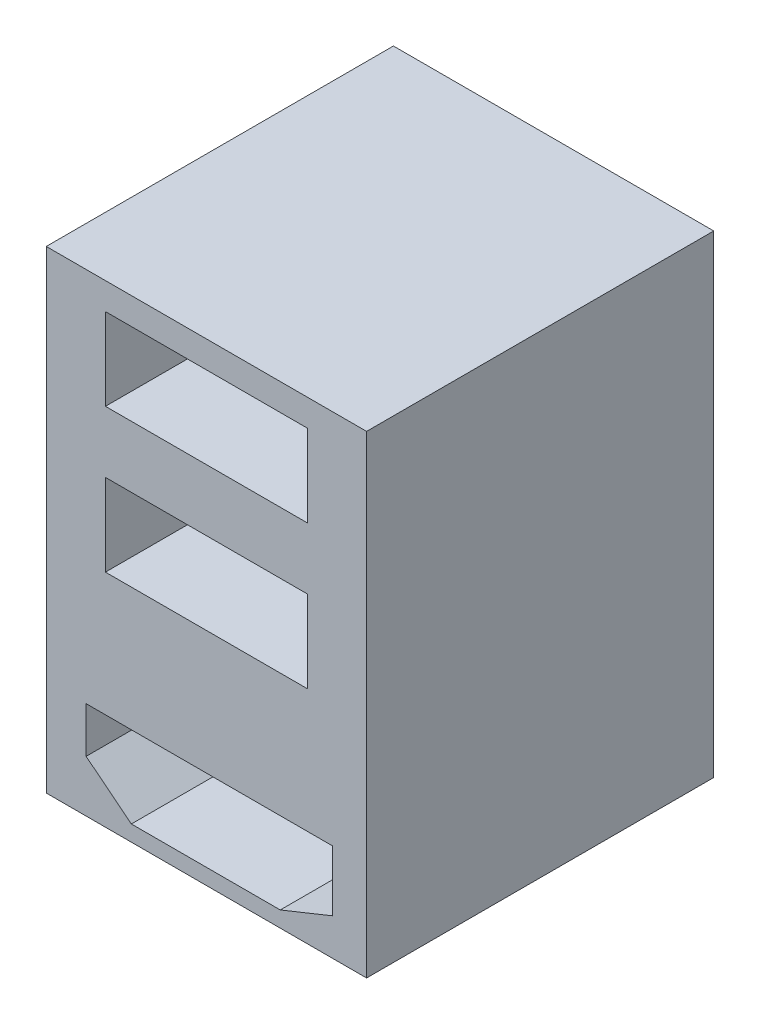
ISO-10303-21;
HEADER;
FILE_DESCRIPTION(('STEP AP214'),'2;1');
FILE_NAME('part.step','',(''),(''),'','','');
FILE_SCHEMA(('AUTOMOTIVE_DESIGN { 1 0 10303 214 1 1 1 1 }'));
ENDSEC;
DATA;
#1=APPLICATION_CONTEXT('core data for automotive mechanical design processes');
#2=APPLICATION_PROTOCOL_DEFINITION('international standard','automotive_design',2000,#1);
#3=PRODUCT_CONTEXT('',#1,'mechanical');
#4=PRODUCT('Part','Part','',(#3));
#5=PRODUCT_RELATED_PRODUCT_CATEGORY('part','',(#4));
#6=PRODUCT_DEFINITION_FORMATION('','',#4);
#7=PRODUCT_DEFINITION_CONTEXT('part definition',#1,'design');
#8=PRODUCT_DEFINITION('design','',#6,#7);
#9=PRODUCT_DEFINITION_SHAPE('','',#8);
#10=(LENGTH_UNIT() NAMED_UNIT(*) SI_UNIT(.MILLI.,.METRE.));
#11=(NAMED_UNIT(*) PLANE_ANGLE_UNIT() SI_UNIT($,.RADIAN.));
#12=(NAMED_UNIT(*) SI_UNIT($,.STERADIAN.) SOLID_ANGLE_UNIT());
#13=UNCERTAINTY_MEASURE_WITH_UNIT(LENGTH_MEASURE(1.E-05),#10,'distance_accuracy_value','');
#14=(GEOMETRIC_REPRESENTATION_CONTEXT(3) GLOBAL_UNCERTAINTY_ASSIGNED_CONTEXT((#13)) GLOBAL_UNIT_ASSIGNED_CONTEXT((#10,
#11,#12)) REPRESENTATION_CONTEXT('',''));
#15=CARTESIAN_POINT('',(0.,0.,0.));
#16=DIRECTION('',(0.,0.,1.));
#17=DIRECTION('',(1.,0.,0.));
#18=AXIS2_PLACEMENT_3D('',#15,#16,#17);
#19=CARTESIAN_POINT('',(114.736360730804,106.960324966085,-10.));
#20=DIRECTION('',(-1.,0.,0.));
#21=DIRECTION('',(0.,-1.,0.));
#22=AXIS2_PLACEMENT_3D('',#19,#20,#21);
#23=PLANE('',#22);
#24=DIRECTION('',(0.,-1.,0.));
#25=VECTOR('',#24,1.);
#26=CARTESIAN_POINT('',(114.736360730804,106.960324966085,0.));
#27=LINE('',#26,#25);
#28=CARTESIAN_POINT('',(114.736360730804,106.960324966085,0.));
#29=VERTEX_POINT('',#28);
#30=CARTESIAN_POINT('',(114.736360730804,76.9603249660852,0.));
#31=VERTEX_POINT('',#30);
#32=EDGE_CURVE('E287',#29,#31,#27,.T.);
#33=ORIENTED_EDGE('',*,*,#32,.F.);
#34=DIRECTION('',(0.,0.,1.));
#35=VECTOR('',#34,1.);
#36=CARTESIAN_POINT('',(114.736360730804,106.960324966085,-10.));
#37=LINE('',#36,#35);
#38=CARTESIAN_POINT('',(114.736360730804,106.960324966085,-22.));
#39=VERTEX_POINT('',#38);
#40=EDGE_CURVE('E11',#39,#29,#37,.T.);
#41=ORIENTED_EDGE('',*,*,#40,.F.);
#42=DIRECTION('',(0.,1.,0.));
#43=VECTOR('',#42,1.);
#44=CARTESIAN_POINT('',(114.736360730804,106.960324966085,-22.));
#45=LINE('',#44,#43);
#46=CARTESIAN_POINT('',(114.736360730804,76.9603249660852,-22.));
#47=VERTEX_POINT('',#46);
#48=EDGE_CURVE('E175',#47,#39,#45,.T.);
#49=ORIENTED_EDGE('',*,*,#48,.F.);
#50=DIRECTION('',(0.,0.,1.));
#51=VECTOR('',#50,1.);
#52=CARTESIAN_POINT('',(114.736360730804,76.9603249660852,-10.));
#53=LINE('',#52,#51);
#54=EDGE_CURVE('E37',#47,#31,#53,.T.);
#55=ORIENTED_EDGE('',*,*,#54,.T.);
#56=EDGE_LOOP('',(#33,#41,#49,#55));
#57=FACE_BOUND('',#56,.T.);
#58=ADVANCED_FACE('F34',(#57),#23,.T.);
#59=CARTESIAN_POINT('',(114.736360730804,106.960324966085,-10.));
#60=DIRECTION('',(0.,1.,0.));
#61=DIRECTION('',(0.,0.,1.));
#62=AXIS2_PLACEMENT_3D('',#59,#60,#61);
#63=PLANE('',#62);
#64=DIRECTION('',(-1.,0.,0.));
#65=VECTOR('',#64,1.);
#66=CARTESIAN_POINT('',(114.736360730804,106.960324966085,0.));
#67=LINE('',#66,#65);
#68=CARTESIAN_POINT('',(135.036360730804,106.960324966085,0.));
#69=VERTEX_POINT('',#68);
#70=EDGE_CURVE('E299',#69,#29,#67,.T.);
#71=ORIENTED_EDGE('',*,*,#70,.F.);
#72=DIRECTION('',(0.,0.,1.));
#73=VECTOR('',#72,1.);
#74=CARTESIAN_POINT('',(135.036360730804,106.960324966085,-10.));
#75=LINE('',#74,#73);
#76=CARTESIAN_POINT('',(135.036360730804,106.960324966085,-22.));
#77=VERTEX_POINT('',#76);
#78=EDGE_CURVE('E42',#77,#69,#75,.T.);
#79=ORIENTED_EDGE('',*,*,#78,.F.);
#80=DIRECTION('',(1.,0.,0.));
#81=VECTOR('',#80,1.);
#82=CARTESIAN_POINT('',(135.036360730804,106.960324966085,-22.));
#83=LINE('',#82,#81);
#84=EDGE_CURVE('E180',#39,#77,#83,.T.);
#85=ORIENTED_EDGE('',*,*,#84,.F.);
#86=ORIENTED_EDGE('',*,*,#40,.T.);
#87=EDGE_LOOP('',(#71,#79,#85,#86));
#88=FACE_BOUND('',#87,.T.);
#89=ADVANCED_FACE('F306',(#88),#63,.T.);
#90=CARTESIAN_POINT('',(135.036360730804,106.960324966085,-10.));
#91=DIRECTION('',(1.,0.,0.));
#92=DIRECTION('',(0.,1.,0.));
#93=AXIS2_PLACEMENT_3D('',#90,#91,#92);
#94=PLANE('',#93);
#95=DIRECTION('',(0.,1.,0.));
#96=VECTOR('',#95,1.);
#97=CARTESIAN_POINT('',(135.036360730804,106.960324966085,0.));
#98=LINE('',#97,#96);
#99=CARTESIAN_POINT('',(135.036360730804,76.9603249660852,0.));
#100=VERTEX_POINT('',#99);
#101=EDGE_CURVE('E165',#100,#69,#98,.T.);
#102=ORIENTED_EDGE('',*,*,#101,.F.);
#103=DIRECTION('',(0.,0.,1.));
#104=VECTOR('',#103,1.);
#105=CARTESIAN_POINT('',(135.036360730804,76.9603249660852,-10.));
#106=LINE('',#105,#104);
#107=CARTESIAN_POINT('',(135.036360730804,76.9603249660852,-22.));
#108=VERTEX_POINT('',#107);
#109=EDGE_CURVE('E159',#108,#100,#106,.T.);
#110=ORIENTED_EDGE('',*,*,#109,.F.);
#111=DIRECTION('',(0.,-1.,0.));
#112=VECTOR('',#111,1.);
#113=CARTESIAN_POINT('',(135.036360730804,106.960324966085,-22.));
#114=LINE('',#113,#112);
#115=EDGE_CURVE('E163',#77,#108,#114,.T.);
#116=ORIENTED_EDGE('',*,*,#115,.F.);
#117=ORIENTED_EDGE('',*,*,#78,.T.);
#118=EDGE_LOOP('',(#102,#110,#116,#117));
#119=FACE_BOUND('',#118,.T.);
#120=ADVANCED_FACE('F161',(#119),#94,.T.);
#121=CARTESIAN_POINT('',(114.736360730804,76.9603249660852,-10.));
#122=DIRECTION('',(0.,-1.,0.));
#123=DIRECTION('',(0.,0.,-1.));
#124=AXIS2_PLACEMENT_3D('',#121,#122,#123);
#125=PLANE('',#124);
#126=DIRECTION('',(1.,0.,0.));
#127=VECTOR('',#126,1.);
#128=CARTESIAN_POINT('',(114.736360730804,76.9603249660852,0.));
#129=LINE('',#128,#127);
#130=EDGE_CURVE('E296',#31,#100,#129,.T.);
#131=ORIENTED_EDGE('',*,*,#130,.F.);
#132=ORIENTED_EDGE('',*,*,#54,.F.);
#133=DIRECTION('',(-1.,0.,0.));
#134=VECTOR('',#133,1.);
#135=CARTESIAN_POINT('',(135.036360730804,76.9603249660852,-22.));
#136=LINE('',#135,#134);
#137=EDGE_CURVE('E170',#108,#47,#136,.T.);
#138=ORIENTED_EDGE('',*,*,#137,.F.);
#139=ORIENTED_EDGE('',*,*,#109,.T.);
#140=EDGE_LOOP('',(#131,#132,#138,#139));
#141=FACE_BOUND('',#140,.T.);
#142=ADVANCED_FACE('F171',(#141),#125,.T.);
#143=CARTESIAN_POINT('',(0.,0.,0.));
#144=DIRECTION('',(0.,0.,1.));
#145=DIRECTION('',(1.,0.,0.));
#146=AXIS2_PLACEMENT_3D('',#143,#144,#145);
#147=PLANE('',#146);
#148=DIRECTION('',(0.,-1.,0.));
#149=VECTOR('',#148,1.);
#150=CARTESIAN_POINT('',(117.262981970112,80.2380171715364,0.));
#151=LINE('',#150,#149);
#152=CARTESIAN_POINT('',(117.262981970112,83.1306826301389,0.));
#153=VERTEX_POINT('',#152);
#154=CARTESIAN_POINT('',(117.262981970112,80.2380171715364,0.));
#155=VERTEX_POINT('',#154);
#156=EDGE_CURVE('E58',#153,#155,#151,.T.);
#157=ORIENTED_EDGE('',*,*,#156,.F.);
#158=DIRECTION('',(-1.,0.,0.));
#159=VECTOR('',#158,1.);
#160=CARTESIAN_POINT('',(132.886839218702,83.1306826301389,0.));
#161=LINE('',#160,#159);
#162=CARTESIAN_POINT('',(132.886839218702,83.1306826301389,0.));
#163=VERTEX_POINT('',#162);
#164=EDGE_CURVE('E189',#163,#153,#161,.T.);
#165=ORIENTED_EDGE('',*,*,#164,.F.);
#166=DIRECTION('',(0.,1.,0.));
#167=VECTOR('',#166,1.);
#168=CARTESIAN_POINT('',(132.886839218702,79.2965784564737,0.));
#169=LINE('',#168,#167);
#170=CARTESIAN_POINT('',(132.886839218702,79.2965784564737,0.));
#171=VERTEX_POINT('',#170);
#172=EDGE_CURVE('E213',#171,#163,#169,.T.);
#173=ORIENTED_EDGE('',*,*,#172,.F.);
#174=DIRECTION('',(0.927687914065825,0.373356577679031,0.));
#175=VECTOR('',#174,1.);
#176=CARTESIAN_POINT('',(129.566618584401,77.9603249660852,0.));
#177=LINE('',#176,#175);
#178=CARTESIAN_POINT('',(129.566618584401,77.9603249660852,0.));
#179=VERTEX_POINT('',#178);
#180=EDGE_CURVE('E210',#179,#171,#177,.T.);
#181=ORIENTED_EDGE('',*,*,#180,.F.);
#182=DIRECTION('',(1.,0.,0.));
#183=VECTOR('',#182,1.);
#184=CARTESIAN_POINT('',(129.566618584401,77.9603249660852,0.));
#185=LINE('',#184,#183);
#186=CARTESIAN_POINT('',(120.129531537468,77.9603249660852,0.));
#187=VERTEX_POINT('',#186);
#188=EDGE_CURVE('E207',#187,#179,#185,.T.);
#189=ORIENTED_EDGE('',*,*,#188,.F.);
#190=DIRECTION('',(0.782935954988961,-0.622102315045944,0.));
#191=VECTOR('',#190,1.);
#192=CARTESIAN_POINT('',(117.262981970112,80.2380171715364,0.));
#193=LINE('',#192,#191);
#194=EDGE_CURVE('E204',#155,#187,#193,.T.);
#195=ORIENTED_EDGE('',*,*,#194,.F.);
#196=EDGE_LOOP('',(#157,#165,#173,#181,#189,#195));
#197=FACE_BOUND('',#196,.T.);
#198=DIRECTION('',(0.,-1.,0.));
#199=VECTOR('',#198,1.);
#200=CARTESIAN_POINT('',(118.486360730804,90.9603249660852,0.));
#201=LINE('',#200,#199);
#202=CARTESIAN_POINT('',(118.486360730804,96.1603249660851,0.));
#203=VERTEX_POINT('',#202);
#204=CARTESIAN_POINT('',(118.486360730804,90.9603249660852,0.));
#205=VERTEX_POINT('',#204);
#206=EDGE_CURVE('E220',#203,#205,#201,.T.);
#207=ORIENTED_EDGE('',*,*,#206,.F.);
#208=DIRECTION('',(-1.,0.,0.));
#209=VECTOR('',#208,1.);
#210=CARTESIAN_POINT('',(131.286360730804,96.1603249660851,0.));
#211=LINE('',#210,#209);
#212=CARTESIAN_POINT('',(131.286360730804,96.1603249660851,0.));
#213=VERTEX_POINT('',#212);
#214=EDGE_CURVE('E234',#213,#203,#211,.T.);
#215=ORIENTED_EDGE('',*,*,#214,.F.);
#216=DIRECTION('',(0.,1.,0.));
#217=VECTOR('',#216,1.);
#218=CARTESIAN_POINT('',(131.286360730804,90.9603249660852,0.));
#219=LINE('',#218,#217);
#220=CARTESIAN_POINT('',(131.286360730804,90.9603249660852,0.));
#221=VERTEX_POINT('',#220);
#222=EDGE_CURVE('E248',#221,#213,#219,.T.);
#223=ORIENTED_EDGE('',*,*,#222,.F.);
#224=DIRECTION('',(1.,0.,0.));
#225=VECTOR('',#224,1.);
#226=CARTESIAN_POINT('',(131.286360730804,90.9603249660852,0.));
#227=LINE('',#226,#225);
#228=EDGE_CURVE('E245',#205,#221,#227,.T.);
#229=ORIENTED_EDGE('',*,*,#228,.F.);
#230=EDGE_LOOP('',(#207,#215,#223,#229));
#231=FACE_BOUND('',#230,.T.);
#232=DIRECTION('',(0.,-1.,0.));
#233=VECTOR('',#232,1.);
#234=CARTESIAN_POINT('',(118.486360730804,100.060324966085,0.));
#235=LINE('',#234,#233);
#236=CARTESIAN_POINT('',(118.486360730804,105.260324966085,0.));
#237=VERTEX_POINT('',#236);
#238=CARTESIAN_POINT('',(118.486360730804,100.060324966085,0.));
#239=VERTEX_POINT('',#238);
#240=EDGE_CURVE('E255',#237,#239,#235,.T.);
#241=ORIENTED_EDGE('',*,*,#240,.F.);
#242=DIRECTION('',(-1.,0.,0.));
#243=VECTOR('',#242,1.);
#244=CARTESIAN_POINT('',(131.286360730804,105.260324966085,0.));
#245=LINE('',#244,#243);
#246=CARTESIAN_POINT('',(131.286360730804,105.260324966085,0.));
#247=VERTEX_POINT('',#246);
#248=EDGE_CURVE('E266',#247,#237,#245,.T.);
#249=ORIENTED_EDGE('',*,*,#248,.F.);
#250=DIRECTION('',(0.,1.,0.));
#251=VECTOR('',#250,1.);
#252=CARTESIAN_POINT('',(131.286360730804,100.060324966085,0.));
#253=LINE('',#252,#251);
#254=CARTESIAN_POINT('',(131.286360730804,100.060324966085,0.));
#255=VERTEX_POINT('',#254);
#256=EDGE_CURVE('E280',#255,#247,#253,.T.);
#257=ORIENTED_EDGE('',*,*,#256,.F.);
#258=DIRECTION('',(1.,0.,0.));
#259=VECTOR('',#258,1.);
#260=CARTESIAN_POINT('',(131.286360730804,100.060324966085,0.));
#261=LINE('',#260,#259);
#262=EDGE_CURVE('E277',#239,#255,#261,.T.);
#263=ORIENTED_EDGE('',*,*,#262,.F.);
#264=EDGE_LOOP('',(#241,#249,#257,#263));
#265=FACE_BOUND('',#264,.T.);
#266=ORIENTED_EDGE('',*,*,#32,.T.);
#267=ORIENTED_EDGE('',*,*,#130,.T.);
#268=ORIENTED_EDGE('',*,*,#101,.T.);
#269=ORIENTED_EDGE('',*,*,#70,.T.);
#270=EDGE_LOOP('',(#266,#267,#268,#269));
#271=FACE_BOUND('',#270,.T.);
#272=ADVANCED_FACE('F305',(#197,#231,#265,#271),#147,.T.);
#273=CARTESIAN_POINT('',(118.486360730804,100.060324966085,-10.));
#274=DIRECTION('',(-1.,0.,0.));
#275=DIRECTION('',(0.,0.,1.));
#276=AXIS2_PLACEMENT_3D('',#273,#274,#275);
#277=PLANE('',#276);
#278=ORIENTED_EDGE('',*,*,#240,.T.);
#279=DIRECTION('',(0.,0.,1.));
#280=VECTOR('',#279,1.);
#281=CARTESIAN_POINT('',(118.486360730804,100.060324966085,-10.));
#282=LINE('',#281,#280);
#283=CARTESIAN_POINT('',(118.486360730804,100.060324966085,-10.));
#284=VERTEX_POINT('',#283);
#285=EDGE_CURVE('E275',#284,#239,#282,.T.);
#286=ORIENTED_EDGE('',*,*,#285,.F.);
#287=DIRECTION('',(0.,-1.,0.));
#288=VECTOR('',#287,1.);
#289=CARTESIAN_POINT('',(118.486360730804,100.060324966085,-10.));
#290=LINE('',#289,#288);
#291=CARTESIAN_POINT('',(118.486360730804,105.260324966085,-10.));
#292=VERTEX_POINT('',#291);
#293=EDGE_CURVE('E262',#292,#284,#290,.T.);
#294=ORIENTED_EDGE('',*,*,#293,.F.);
#295=DIRECTION('',(0.,0.,1.));
#296=VECTOR('',#295,1.);
#297=CARTESIAN_POINT('',(118.486360730804,105.260324966085,-10.));
#298=LINE('',#297,#296);
#299=EDGE_CURVE('E285',#292,#237,#298,.T.);
#300=ORIENTED_EDGE('',*,*,#299,.T.);
#301=EDGE_LOOP('',(#278,#286,#294,#300));
#302=FACE_BOUND('',#301,.T.);
#303=ADVANCED_FACE('F324',(#302),#277,.F.);
#304=CARTESIAN_POINT('',(131.286360730804,105.260324966085,-10.));
#305=DIRECTION('',(0.,1.,0.));
#306=DIRECTION('',(0.,0.,1.));
#307=AXIS2_PLACEMENT_3D('',#304,#305,#306);
#308=PLANE('',#307);
#309=ORIENTED_EDGE('',*,*,#248,.T.);
#310=ORIENTED_EDGE('',*,*,#299,.F.);
#311=DIRECTION('',(-1.,0.,0.));
#312=VECTOR('',#311,1.);
#313=CARTESIAN_POINT('',(131.286360730804,105.260324966085,-10.));
#314=LINE('',#313,#312);
#315=CARTESIAN_POINT('',(131.286360730804,105.260324966085,-10.));
#316=VERTEX_POINT('',#315);
#317=EDGE_CURVE('E272',#316,#292,#314,.T.);
#318=ORIENTED_EDGE('',*,*,#317,.F.);
#319=DIRECTION('',(0.,0.,1.));
#320=VECTOR('',#319,1.);
#321=CARTESIAN_POINT('',(131.286360730804,105.260324966085,-10.));
#322=LINE('',#321,#320);
#323=EDGE_CURVE('E288',#316,#247,#322,.T.);
#324=ORIENTED_EDGE('',*,*,#323,.T.);
#325=EDGE_LOOP('',(#309,#310,#318,#324));
#326=FACE_BOUND('',#325,.T.);
#327=ADVANCED_FACE('F329',(#326),#308,.F.);
#328=CARTESIAN_POINT('',(131.286360730804,100.060324966085,-10.));
#329=DIRECTION('',(1.,0.,0.));
#330=DIRECTION('',(0.,1.,0.));
#331=AXIS2_PLACEMENT_3D('',#328,#329,#330);
#332=PLANE('',#331);
#333=ORIENTED_EDGE('',*,*,#256,.T.);
#334=ORIENTED_EDGE('',*,*,#323,.F.);
#335=DIRECTION('',(0.,1.,0.));
#336=VECTOR('',#335,1.);
#337=CARTESIAN_POINT('',(131.286360730804,100.060324966085,-10.));
#338=LINE('',#337,#336);
#339=CARTESIAN_POINT('',(131.286360730804,100.060324966085,-10.));
#340=VERTEX_POINT('',#339);
#341=EDGE_CURVE('E269',#340,#316,#338,.T.);
#342=ORIENTED_EDGE('',*,*,#341,.F.);
#343=DIRECTION('',(0.,0.,1.));
#344=VECTOR('',#343,1.);
#345=CARTESIAN_POINT('',(131.286360730804,100.060324966085,-10.));
#346=LINE('',#345,#344);
#347=EDGE_CURVE('E290',#340,#255,#346,.T.);
#348=ORIENTED_EDGE('',*,*,#347,.T.);
#349=EDGE_LOOP('',(#333,#334,#342,#348));
#350=FACE_BOUND('',#349,.T.);
#351=ADVANCED_FACE('F352',(#350),#332,.F.);
#352=CARTESIAN_POINT('',(131.286360730804,100.060324966085,-10.));
#353=DIRECTION('',(0.,-1.,0.));
#354=DIRECTION('',(1.,0.,0.));
#355=AXIS2_PLACEMENT_3D('',#352,#353,#354);
#356=PLANE('',#355);
#357=ORIENTED_EDGE('',*,*,#262,.T.);
#358=ORIENTED_EDGE('',*,*,#347,.F.);
#359=DIRECTION('',(1.,0.,0.));
#360=VECTOR('',#359,1.);
#361=CARTESIAN_POINT('',(131.286360730804,100.060324966085,-10.));
#362=LINE('',#361,#360);
#363=EDGE_CURVE('E265',#284,#340,#362,.T.);
#364=ORIENTED_EDGE('',*,*,#363,.F.);
#365=ORIENTED_EDGE('',*,*,#285,.T.);
#366=EDGE_LOOP('',(#357,#358,#364,#365));
#367=FACE_BOUND('',#366,.T.);
#368=ADVANCED_FACE('F345',(#367),#356,.F.);
#369=CARTESIAN_POINT('',(118.486360730804,90.9603249660852,-10.));
#370=DIRECTION('',(-1.,0.,0.));
#371=DIRECTION('',(0.,-1.,0.));
#372=AXIS2_PLACEMENT_3D('',#369,#370,#371);
#373=PLANE('',#372);
#374=ORIENTED_EDGE('',*,*,#206,.T.);
#375=DIRECTION('',(0.,0.,1.));
#376=VECTOR('',#375,1.);
#377=CARTESIAN_POINT('',(118.486360730804,90.9603249660852,-10.));
#378=LINE('',#377,#376);
#379=CARTESIAN_POINT('',(118.486360730804,90.9603249660852,-10.));
#380=VERTEX_POINT('',#379);
#381=EDGE_CURVE('E243',#380,#205,#378,.T.);
#382=ORIENTED_EDGE('',*,*,#381,.F.);
#383=DIRECTION('',(0.,-1.,0.));
#384=VECTOR('',#383,1.);
#385=CARTESIAN_POINT('',(118.486360730804,90.9603249660852,-10.));
#386=LINE('',#385,#384);
#387=CARTESIAN_POINT('',(118.486360730804,96.1603249660851,-10.));
#388=VERTEX_POINT('',#387);
#389=EDGE_CURVE('E230',#388,#380,#386,.T.);
#390=ORIENTED_EDGE('',*,*,#389,.F.);
#391=DIRECTION('',(0.,0.,1.));
#392=VECTOR('',#391,1.);
#393=CARTESIAN_POINT('',(118.486360730804,96.1603249660851,-10.));
#394=LINE('',#393,#392);
#395=EDGE_CURVE('E253',#388,#203,#394,.T.);
#396=ORIENTED_EDGE('',*,*,#395,.T.);
#397=EDGE_LOOP('',(#374,#382,#390,#396));
#398=FACE_BOUND('',#397,.T.);
#399=ADVANCED_FACE('F359',(#398),#373,.F.);
#400=CARTESIAN_POINT('',(131.286360730804,96.1603249660851,-10.));
#401=DIRECTION('',(0.,1.,0.));
#402=DIRECTION('',(0.,0.,1.));
#403=AXIS2_PLACEMENT_3D('',#400,#401,#402);
#404=PLANE('',#403);
#405=ORIENTED_EDGE('',*,*,#214,.T.);
#406=ORIENTED_EDGE('',*,*,#395,.F.);
#407=DIRECTION('',(-1.,0.,0.));
#408=VECTOR('',#407,1.);
#409=CARTESIAN_POINT('',(131.286360730804,96.1603249660851,-10.));
#410=LINE('',#409,#408);
#411=CARTESIAN_POINT('',(131.286360730804,96.1603249660851,-10.));
#412=VERTEX_POINT('',#411);
#413=EDGE_CURVE('E240',#412,#388,#410,.T.);
#414=ORIENTED_EDGE('',*,*,#413,.F.);
#415=DIRECTION('',(0.,0.,1.));
#416=VECTOR('',#415,1.);
#417=CARTESIAN_POINT('',(131.286360730804,96.1603249660851,-10.));
#418=LINE('',#417,#416);
#419=EDGE_CURVE('E256',#412,#213,#418,.T.);
#420=ORIENTED_EDGE('',*,*,#419,.T.);
#421=EDGE_LOOP('',(#405,#406,#414,#420));
#422=FACE_BOUND('',#421,.T.);
#423=ADVANCED_FACE('F365',(#422),#404,.F.);
#424=CARTESIAN_POINT('',(131.286360730804,90.9603249660852,-10.));
#425=DIRECTION('',(1.,0.,0.));
#426=DIRECTION('',(0.,0.,-1.));
#427=AXIS2_PLACEMENT_3D('',#424,#425,#426);
#428=PLANE('',#427);
#429=ORIENTED_EDGE('',*,*,#222,.T.);
#430=ORIENTED_EDGE('',*,*,#419,.F.);
#431=DIRECTION('',(0.,1.,0.));
#432=VECTOR('',#431,1.);
#433=CARTESIAN_POINT('',(131.286360730804,90.9603249660852,-10.));
#434=LINE('',#433,#432);
#435=CARTESIAN_POINT('',(131.286360730804,90.9603249660852,-10.));
#436=VERTEX_POINT('',#435);
#437=EDGE_CURVE('E237',#436,#412,#434,.T.);
#438=ORIENTED_EDGE('',*,*,#437,.F.);
#439=DIRECTION('',(0.,0.,1.));
#440=VECTOR('',#439,1.);
#441=CARTESIAN_POINT('',(131.286360730804,90.9603249660852,-10.));
#442=LINE('',#441,#440);
#443=EDGE_CURVE('E258',#436,#221,#442,.T.);
#444=ORIENTED_EDGE('',*,*,#443,.T.);
#445=EDGE_LOOP('',(#429,#430,#438,#444));
#446=FACE_BOUND('',#445,.T.);
#447=ADVANCED_FACE('F371',(#446),#428,.F.);
#448=CARTESIAN_POINT('',(131.286360730804,90.9603249660852,-10.));
#449=DIRECTION('',(0.,-1.,0.));
#450=DIRECTION('',(0.,0.,-1.));
#451=AXIS2_PLACEMENT_3D('',#448,#449,#450);
#452=PLANE('',#451);
#453=ORIENTED_EDGE('',*,*,#228,.T.);
#454=ORIENTED_EDGE('',*,*,#443,.F.);
#455=DIRECTION('',(1.,0.,0.));
#456=VECTOR('',#455,1.);
#457=CARTESIAN_POINT('',(131.286360730804,90.9603249660852,-10.));
#458=LINE('',#457,#456);
#459=EDGE_CURVE('E233',#380,#436,#458,.T.);
#460=ORIENTED_EDGE('',*,*,#459,.F.);
#461=ORIENTED_EDGE('',*,*,#381,.T.);
#462=EDGE_LOOP('',(#453,#454,#460,#461));
#463=FACE_BOUND('',#462,.T.);
#464=ADVANCED_FACE('F367',(#463),#452,.F.);
#465=CARTESIAN_POINT('',(117.262981970112,80.2380171715364,-10.));
#466=DIRECTION('',(-1.,0.,0.));
#467=DIRECTION('',(0.,0.,1.));
#468=AXIS2_PLACEMENT_3D('',#465,#466,#467);
#469=PLANE('',#468);
#470=ORIENTED_EDGE('',*,*,#156,.T.);
#471=DIRECTION('',(0.,0.,1.));
#472=VECTOR('',#471,1.);
#473=CARTESIAN_POINT('',(117.262981970112,80.2380171715364,-10.));
#474=LINE('',#473,#472);
#475=CARTESIAN_POINT('',(117.262981970112,80.2380171715364,-10.));
#476=VERTEX_POINT('',#475);
#477=EDGE_CURVE('E202',#476,#155,#474,.T.);
#478=ORIENTED_EDGE('',*,*,#477,.F.);
#479=DIRECTION('',(0.,-1.,0.));
#480=VECTOR('',#479,1.);
#481=CARTESIAN_POINT('',(117.262981970112,80.2380171715364,-10.));
#482=LINE('',#481,#480);
#483=CARTESIAN_POINT('',(117.262981970112,83.1306826301389,-10.));
#484=VERTEX_POINT('',#483);
#485=EDGE_CURVE('E185',#484,#476,#482,.T.);
#486=ORIENTED_EDGE('',*,*,#485,.F.);
#487=DIRECTION('',(0.,0.,1.));
#488=VECTOR('',#487,1.);
#489=CARTESIAN_POINT('',(117.262981970112,83.1306826301389,-10.));
#490=LINE('',#489,#488);
#491=EDGE_CURVE('E218',#484,#153,#490,.T.);
#492=ORIENTED_EDGE('',*,*,#491,.T.);
#493=EDGE_LOOP('',(#470,#478,#486,#492));
#494=FACE_BOUND('',#493,.T.);
#495=ADVANCED_FACE('F370',(#494),#469,.F.);
#496=CARTESIAN_POINT('',(132.886839218702,83.1306826301389,-10.));
#497=DIRECTION('',(0.,1.,0.));
#498=DIRECTION('',(-1.,0.,0.));
#499=AXIS2_PLACEMENT_3D('',#496,#497,#498);
#500=PLANE('',#499);
#501=ORIENTED_EDGE('',*,*,#164,.T.);
#502=ORIENTED_EDGE('',*,*,#491,.F.);
#503=DIRECTION('',(-1.,0.,0.));
#504=VECTOR('',#503,1.);
#505=CARTESIAN_POINT('',(132.886839218702,83.1306826301389,-10.));
#506=LINE('',#505,#504);
#507=CARTESIAN_POINT('',(132.886839218702,83.1306826301389,-10.));
#508=VERTEX_POINT('',#507);
#509=EDGE_CURVE('E199',#508,#484,#506,.T.);
#510=ORIENTED_EDGE('',*,*,#509,.F.);
#511=DIRECTION('',(0.,0.,1.));
#512=VECTOR('',#511,1.);
#513=CARTESIAN_POINT('',(132.886839218702,83.1306826301389,-10.));
#514=LINE('',#513,#512);
#515=EDGE_CURVE('E221',#508,#163,#514,.T.);
#516=ORIENTED_EDGE('',*,*,#515,.T.);
#517=EDGE_LOOP('',(#501,#502,#510,#516));
#518=FACE_BOUND('',#517,.T.);
#519=ADVANCED_FACE('F381',(#518),#500,.F.);
#520=CARTESIAN_POINT('',(132.886839218702,79.2965784564737,-10.));
#521=DIRECTION('',(1.,0.,0.));
#522=DIRECTION('',(0.,1.,0.));
#523=AXIS2_PLACEMENT_3D('',#520,#521,#522);
#524=PLANE('',#523);
#525=ORIENTED_EDGE('',*,*,#172,.T.);
#526=ORIENTED_EDGE('',*,*,#515,.F.);
#527=DIRECTION('',(0.,1.,0.));
#528=VECTOR('',#527,1.);
#529=CARTESIAN_POINT('',(132.886839218702,79.2965784564737,-10.));
#530=LINE('',#529,#528);
#531=CARTESIAN_POINT('',(132.886839218702,79.2965784564737,-10.));
#532=VERTEX_POINT('',#531);
#533=EDGE_CURVE('E196',#532,#508,#530,.T.);
#534=ORIENTED_EDGE('',*,*,#533,.F.);
#535=DIRECTION('',(0.,0.,1.));
#536=VECTOR('',#535,1.);
#537=CARTESIAN_POINT('',(132.886839218702,79.2965784564737,-10.));
#538=LINE('',#537,#536);
#539=EDGE_CURVE('E223',#532,#171,#538,.T.);
#540=ORIENTED_EDGE('',*,*,#539,.T.);
#541=EDGE_LOOP('',(#525,#526,#534,#540));
#542=FACE_BOUND('',#541,.T.);
#543=ADVANCED_FACE('F392',(#542),#524,.F.);
#544=CARTESIAN_POINT('',(129.566618584401,77.9603249660852,-10.));
#545=DIRECTION('',(0.373356577679031,-0.927687914065825,0.));
#546=DIRECTION('',(0.927687914065825,0.373356577679031,0.));
#547=AXIS2_PLACEMENT_3D('',#544,#545,#546);
#548=PLANE('',#547);
#549=ORIENTED_EDGE('',*,*,#180,.T.);
#550=ORIENTED_EDGE('',*,*,#539,.F.);
#551=DIRECTION('',(0.927687914065825,0.373356577679031,0.));
#552=VECTOR('',#551,1.);
#553=CARTESIAN_POINT('',(129.566618584401,77.9603249660852,-10.));
#554=LINE('',#553,#552);
#555=CARTESIAN_POINT('',(129.566618584401,77.9603249660852,-10.));
#556=VERTEX_POINT('',#555);
#557=EDGE_CURVE('E193',#556,#532,#554,.T.);
#558=ORIENTED_EDGE('',*,*,#557,.F.);
#559=DIRECTION('',(0.,0.,1.));
#560=VECTOR('',#559,1.);
#561=CARTESIAN_POINT('',(129.566618584401,77.9603249660852,-10.));
#562=LINE('',#561,#560);
#563=EDGE_CURVE('E225',#556,#179,#562,.T.);
#564=ORIENTED_EDGE('',*,*,#563,.T.);
#565=EDGE_LOOP('',(#549,#550,#558,#564));
#566=FACE_BOUND('',#565,.T.);
#567=ADVANCED_FACE('F389',(#566),#548,.F.);
#568=CARTESIAN_POINT('',(129.566618584401,77.9603249660852,-10.));
#569=DIRECTION('',(0.,-1.,0.));
#570=DIRECTION('',(0.,0.,-1.));
#571=AXIS2_PLACEMENT_3D('',#568,#569,#570);
#572=PLANE('',#571);
#573=ORIENTED_EDGE('',*,*,#188,.T.);
#574=ORIENTED_EDGE('',*,*,#563,.F.);
#575=DIRECTION('',(1.,0.,0.));
#576=VECTOR('',#575,1.);
#577=CARTESIAN_POINT('',(129.566618584401,77.9603249660852,-10.));
#578=LINE('',#577,#576);
#579=CARTESIAN_POINT('',(120.129531537468,77.9603249660852,-10.));
#580=VERTEX_POINT('',#579);
#581=EDGE_CURVE('E50',#580,#556,#578,.T.);
#582=ORIENTED_EDGE('',*,*,#581,.F.);
#583=DIRECTION('',(0.,0.,1.));
#584=VECTOR('',#583,1.);
#585=CARTESIAN_POINT('',(120.129531537468,77.9603249660852,-10.));
#586=LINE('',#585,#584);
#587=EDGE_CURVE('E227',#580,#187,#586,.T.);
#588=ORIENTED_EDGE('',*,*,#587,.T.);
#589=EDGE_LOOP('',(#573,#574,#582,#588));
#590=FACE_BOUND('',#589,.T.);
#591=ADVANCED_FACE('F385',(#590),#572,.F.);
#592=CARTESIAN_POINT('',(117.262981970112,80.2380171715364,-10.));
#593=DIRECTION('',(-0.622102315045944,-0.782935954988961,0.));
#594=DIRECTION('',(0.782935954988961,-0.622102315045944,0.));
#595=AXIS2_PLACEMENT_3D('',#592,#593,#594);
#596=PLANE('',#595);
#597=ORIENTED_EDGE('',*,*,#194,.T.);
#598=ORIENTED_EDGE('',*,*,#587,.F.);
#599=DIRECTION('',(0.782935954988961,-0.622102315045944,0.));
#600=VECTOR('',#599,1.);
#601=CARTESIAN_POINT('',(117.262981970112,80.2380171715364,-10.));
#602=LINE('',#601,#600);
#603=EDGE_CURVE('E188',#476,#580,#602,.T.);
#604=ORIENTED_EDGE('',*,*,#603,.F.);
#605=ORIENTED_EDGE('',*,*,#477,.T.);
#606=EDGE_LOOP('',(#597,#598,#604,#605));
#607=FACE_BOUND('',#606,.T.);
#608=ADVANCED_FACE('F382',(#607),#596,.F.);
#609=CARTESIAN_POINT('',(0.,0.,-10.));
#610=DIRECTION('',(0.,0.,-1.));
#611=DIRECTION('',(-1.,0.,0.));
#612=AXIS2_PLACEMENT_3D('',#609,#610,#611);
#613=PLANE('',#612);
#614=ORIENTED_EDGE('',*,*,#341,.T.);
#615=ORIENTED_EDGE('',*,*,#317,.T.);
#616=ORIENTED_EDGE('',*,*,#293,.T.);
#617=ORIENTED_EDGE('',*,*,#363,.T.);
#618=EDGE_LOOP('',(#614,#615,#616,#617));
#619=FACE_BOUND('',#618,.T.);
#620=ADVANCED_FACE('F348',(#619),#613,.F.);
#621=ORIENTED_EDGE('',*,*,#437,.T.);
#622=ORIENTED_EDGE('',*,*,#413,.T.);
#623=ORIENTED_EDGE('',*,*,#389,.T.);
#624=ORIENTED_EDGE('',*,*,#459,.T.);
#625=EDGE_LOOP('',(#621,#622,#623,#624));
#626=FACE_BOUND('',#625,.T.);
#627=ADVANCED_FACE('F403',(#626),#613,.F.);
#628=ORIENTED_EDGE('',*,*,#533,.T.);
#629=ORIENTED_EDGE('',*,*,#509,.T.);
#630=ORIENTED_EDGE('',*,*,#485,.T.);
#631=ORIENTED_EDGE('',*,*,#603,.T.);
#632=ORIENTED_EDGE('',*,*,#581,.T.);
#633=ORIENTED_EDGE('',*,*,#557,.T.);
#634=EDGE_LOOP('',(#628,#629,#630,#631,#632,#633));
#635=FACE_BOUND('',#634,.T.);
#636=ADVANCED_FACE('F400',(#635),#613,.F.);
#637=CARTESIAN_POINT('',(0.,0.,-22.));
#638=DIRECTION('',(0.,0.,-1.));
#639=DIRECTION('',(-1.,0.,0.));
#640=AXIS2_PLACEMENT_3D('',#637,#638,#639);
#641=PLANE('',#640);
#642=ORIENTED_EDGE('',*,*,#115,.T.);
#643=ORIENTED_EDGE('',*,*,#137,.T.);
#644=ORIENTED_EDGE('',*,*,#48,.T.);
#645=ORIENTED_EDGE('',*,*,#84,.T.);
#646=EDGE_LOOP('',(#642,#643,#644,#645));
#647=FACE_BOUND('',#646,.T.);
#648=ADVANCED_FACE('F178',(#647),#641,.T.);
#649=CLOSED_SHELL('',(#58,#89,#120,#142,#272,#303,#327,#351,#368,#399,#423,#447,#464,#495,#519,
#543,#567,#591,#608,#620,#627,#636,#648));
#650=MANIFOLD_SOLID_BREP('B2',#649);
#651=ADVANCED_BREP_SHAPE_REPRESENTATION('',(#18,#650),#14);
#652=SHAPE_DEFINITION_REPRESENTATION(#9,#651);
ENDSEC;
END-ISO-10303-21;
